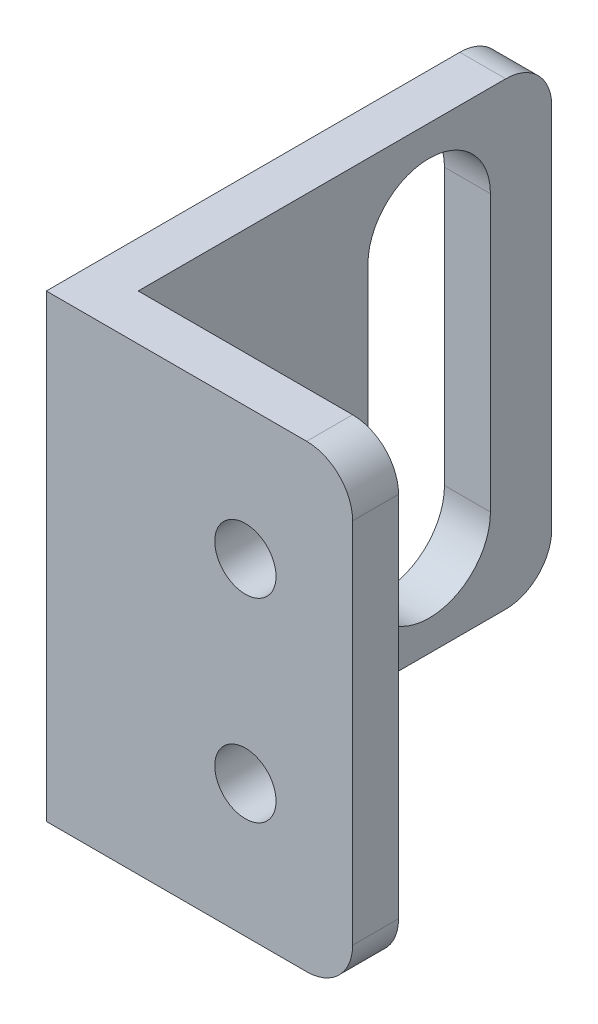
ISO-10303-21;
HEADER;
FILE_DESCRIPTION(('STEP AP214'),'2;1');
FILE_NAME('part.step','',(''),(''),'','','');
FILE_SCHEMA(('AUTOMOTIVE_DESIGN { 1 0 10303 214 1 1 1 1 }'));
ENDSEC;
DATA;
#1=APPLICATION_CONTEXT('core data for automotive mechanical design processes');
#2=APPLICATION_PROTOCOL_DEFINITION('international standard','automotive_design',2000,#1);
#3=PRODUCT_CONTEXT('',#1,'mechanical');
#4=PRODUCT('Part','Part','',(#3));
#5=PRODUCT_RELATED_PRODUCT_CATEGORY('part','',(#4));
#6=PRODUCT_DEFINITION_FORMATION('','',#4);
#7=PRODUCT_DEFINITION_CONTEXT('part definition',#1,'design');
#8=PRODUCT_DEFINITION('design','',#6,#7);
#9=PRODUCT_DEFINITION_SHAPE('','',#8);
#10=(LENGTH_UNIT() NAMED_UNIT(*) SI_UNIT(.MILLI.,.METRE.));
#11=(NAMED_UNIT(*) PLANE_ANGLE_UNIT() SI_UNIT($,.RADIAN.));
#12=(NAMED_UNIT(*) SI_UNIT($,.STERADIAN.) SOLID_ANGLE_UNIT());
#13=UNCERTAINTY_MEASURE_WITH_UNIT(LENGTH_MEASURE(1.E-05),#10,'distance_accuracy_value','');
#14=(GEOMETRIC_REPRESENTATION_CONTEXT(3) GLOBAL_UNCERTAINTY_ASSIGNED_CONTEXT((#13)) GLOBAL_UNIT_ASSIGNED_CONTEXT((#10,
#11,#12)) REPRESENTATION_CONTEXT('',''));
#15=CARTESIAN_POINT('',(0.,0.,0.));
#16=DIRECTION('',(0.,0.,1.));
#17=DIRECTION('',(1.,0.,0.));
#18=AXIS2_PLACEMENT_3D('',#15,#16,#17);
#19=CARTESIAN_POINT('',(-1.5,30.,0.));
#20=DIRECTION('',(1.,0.,0.));
#21=DIRECTION('',(0.,0.,-1.));
#22=AXIS2_PLACEMENT_3D('',#19,#20,#21);
#23=PLANE('',#22);
#24=DIRECTION('',(0.,-1.,0.));
#25=VECTOR('',#24,1.);
#26=CARTESIAN_POINT('',(-1.5,24.,-11.));
#27=LINE('',#26,#25);
#28=CARTESIAN_POINT('',(-1.5,24.,-11.));
#29=VERTEX_POINT('',#28);
#30=CARTESIAN_POINT('',(-1.5,6.,-11.));
#31=VERTEX_POINT('',#30);
#32=EDGE_CURVE('E160',#29,#31,#27,.T.);
#33=ORIENTED_EDGE('',*,*,#32,.F.);
#34=CARTESIAN_POINT('',(-1.5,24.,-7.));
#35=DIRECTION('',(-1.,0.,0.));
#36=DIRECTION('',(0.,0.,1.));
#37=AXIS2_PLACEMENT_3D('',#34,#35,#36);
#38=CIRCLE('',#37,4.);
#39=CARTESIAN_POINT('',(-1.5,24.,-2.99999999999999));
#40=VERTEX_POINT('',#39);
#41=EDGE_CURVE('E165',#40,#29,#38,.T.);
#42=ORIENTED_EDGE('',*,*,#41,.F.);
#43=DIRECTION('',(0.,1.,0.));
#44=VECTOR('',#43,1.);
#45=CARTESIAN_POINT('',(-1.5,24.,-2.99999999999999));
#46=LINE('',#45,#44);
#47=CARTESIAN_POINT('',(-1.5,6.,-2.99999999999999));
#48=VERTEX_POINT('',#47);
#49=EDGE_CURVE('E169',#48,#40,#46,.T.);
#50=ORIENTED_EDGE('',*,*,#49,.F.);
#51=CARTESIAN_POINT('',(-1.5,6.,-7.));
#52=DIRECTION('',(-1.,0.,0.));
#53=DIRECTION('',(0.,0.,1.));
#54=AXIS2_PLACEMENT_3D('',#51,#52,#53);
#55=CIRCLE('',#54,4.);
#56=EDGE_CURVE('E149',#31,#48,#55,.T.);
#57=ORIENTED_EDGE('',*,*,#56,.F.);
#58=EDGE_LOOP('',(#33,#42,#50,#57));
#59=FACE_BOUND('',#58,.T.);
#60=DIRECTION('',(0.,-1.,0.));
#61=VECTOR('',#60,1.);
#62=CARTESIAN_POINT('',(-1.5,30.,-15.));
#63=LINE('',#62,#61);
#64=CARTESIAN_POINT('',(-1.5,27.,-15.));
#65=VERTEX_POINT('',#64);
#66=CARTESIAN_POINT('',(-1.5,3.,-15.));
#67=VERTEX_POINT('',#66);
#68=EDGE_CURVE('E196',#65,#67,#63,.T.);
#69=ORIENTED_EDGE('',*,*,#68,.T.);
#70=CARTESIAN_POINT('',(-1.5,3.,-12.));
#71=DIRECTION('',(1.,0.,0.));
#72=DIRECTION('',(0.,0.,-1.));
#73=AXIS2_PLACEMENT_3D('',#70,#71,#72);
#74=CIRCLE('',#73,3.);
#75=CARTESIAN_POINT('',(-1.5,0.,-12.));
#76=VERTEX_POINT('',#75);
#77=EDGE_CURVE('E249',#67,#76,#74,.F.);
#78=ORIENTED_EDGE('',*,*,#77,.T.);
#79=DIRECTION('',(0.,0.,1.));
#80=VECTOR('',#79,1.);
#81=CARTESIAN_POINT('',(-1.5,0.,0.));
#82=LINE('',#81,#80);
#83=CARTESIAN_POINT('',(-1.5,0.,15.));
#84=VERTEX_POINT('',#83);
#85=EDGE_CURVE('E197',#76,#84,#82,.T.);
#86=ORIENTED_EDGE('',*,*,#85,.T.);
#87=DIRECTION('',(0.,-1.,0.));
#88=VECTOR('',#87,1.);
#89=CARTESIAN_POINT('',(-1.5,30.,15.));
#90=LINE('',#89,#88);
#91=CARTESIAN_POINT('',(-1.5,30.,15.));
#92=VERTEX_POINT('',#91);
#93=EDGE_CURVE('E219',#92,#84,#90,.T.);
#94=ORIENTED_EDGE('',*,*,#93,.F.);
#95=DIRECTION('',(0.,0.,1.));
#96=VECTOR('',#95,1.);
#97=CARTESIAN_POINT('',(-1.5,30.,0.));
#98=LINE('',#97,#96);
#99=CARTESIAN_POINT('',(-1.5,30.,-12.));
#100=VERTEX_POINT('',#99);
#101=EDGE_CURVE('E185',#100,#92,#98,.T.);
#102=ORIENTED_EDGE('',*,*,#101,.F.);
#103=CARTESIAN_POINT('',(-1.5,27.,-12.));
#104=DIRECTION('',(1.,0.,0.));
#105=DIRECTION('',(0.,0.,-1.));
#106=AXIS2_PLACEMENT_3D('',#103,#104,#105);
#107=CIRCLE('',#106,3.);
#108=EDGE_CURVE('E247',#100,#65,#107,.F.);
#109=ORIENTED_EDGE('',*,*,#108,.T.);
#110=EDGE_LOOP('',(#69,#78,#86,#94,#102,#109));
#111=FACE_BOUND('',#110,.T.);
#112=ADVANCED_FACE('F43',(#59,#111),#23,.F.);
#113=CARTESIAN_POINT('',(0.,30.,15.));
#114=DIRECTION('',(0.,0.,-1.));
#115=DIRECTION('',(-1.,0.,0.));
#116=AXIS2_PLACEMENT_3D('',#113,#114,#115);
#117=PLANE('',#116);
#118=CARTESIAN_POINT('',(11.5,21.35,15.));
#119=DIRECTION('',(0.,0.,1.));
#120=DIRECTION('',(1.,0.,0.));
#121=AXIS2_PLACEMENT_3D('',#118,#119,#120);
#122=CIRCLE('',#121,2.);
#123=CARTESIAN_POINT('',(13.5,21.35,15.));
#124=VERTEX_POINT('',#123);
#125=EDGE_CURVE('E179',#124,#124,#122,.T.);
#126=ORIENTED_EDGE('',*,*,#125,.F.);
#127=EDGE_LOOP('',(#126));
#128=FACE_BOUND('',#127,.T.);
#129=CARTESIAN_POINT('',(11.5000000000001,8.65,15.));
#130=DIRECTION('',(0.,0.,1.));
#131=DIRECTION('',(1.,0.,0.));
#132=AXIS2_PLACEMENT_3D('',#129,#130,#131);
#133=CIRCLE('',#132,2.);
#134=CARTESIAN_POINT('',(13.5000000000001,8.65,15.));
#135=VERTEX_POINT('',#134);
#136=EDGE_CURVE('E176',#135,#135,#133,.T.);
#137=ORIENTED_EDGE('',*,*,#136,.F.);
#138=EDGE_LOOP('',(#137));
#139=FACE_BOUND('',#138,.T.);
#140=DIRECTION('',(0.,-1.,0.));
#141=VECTOR('',#140,1.);
#142=CARTESIAN_POINT('',(18.5,30.,15.));
#143=LINE('',#142,#141);
#144=CARTESIAN_POINT('',(18.5,27.,15.));
#145=VERTEX_POINT('',#144);
#146=CARTESIAN_POINT('',(18.5,3.,15.));
#147=VERTEX_POINT('',#146);
#148=EDGE_CURVE('E217',#145,#147,#143,.T.);
#149=ORIENTED_EDGE('',*,*,#148,.F.);
#150=CARTESIAN_POINT('',(15.5,27.,15.));
#151=DIRECTION('',(0.,0.,-1.));
#152=DIRECTION('',(-1.,0.,0.));
#153=AXIS2_PLACEMENT_3D('',#150,#151,#152);
#154=CIRCLE('',#153,3.);
#155=CARTESIAN_POINT('',(15.5,30.,15.));
#156=VERTEX_POINT('',#155);
#157=EDGE_CURVE('E11',#145,#156,#154,.F.);
#158=ORIENTED_EDGE('',*,*,#157,.T.);
#159=DIRECTION('',(1.,0.,0.));
#160=VECTOR('',#159,1.);
#161=CARTESIAN_POINT('',(0.,30.,15.));
#162=LINE('',#161,#160);
#163=EDGE_CURVE('E187',#92,#156,#162,.T.);
#164=ORIENTED_EDGE('',*,*,#163,.F.);
#165=ORIENTED_EDGE('',*,*,#93,.T.);
#166=DIRECTION('',(1.,0.,0.));
#167=VECTOR('',#166,1.);
#168=CARTESIAN_POINT('',(0.,0.,15.));
#169=LINE('',#168,#167);
#170=CARTESIAN_POINT('',(15.5,0.,15.));
#171=VERTEX_POINT('',#170);
#172=EDGE_CURVE('E199',#84,#171,#169,.T.);
#173=ORIENTED_EDGE('',*,*,#172,.T.);
#174=CARTESIAN_POINT('',(15.5,3.,15.));
#175=DIRECTION('',(0.,0.,-1.));
#176=DIRECTION('',(-1.,0.,0.));
#177=AXIS2_PLACEMENT_3D('',#174,#175,#176);
#178=CIRCLE('',#177,3.);
#179=EDGE_CURVE('E51',#171,#147,#178,.F.);
#180=ORIENTED_EDGE('',*,*,#179,.T.);
#181=EDGE_LOOP('',(#149,#158,#164,#165,#173,#180));
#182=FACE_BOUND('',#181,.T.);
#183=ADVANCED_FACE('F281',(#128,#139,#182),#117,.F.);
#184=CARTESIAN_POINT('',(18.5,30.,0.));
#185=DIRECTION('',(-1.,0.,0.));
#186=DIRECTION('',(0.,0.,1.));
#187=AXIS2_PLACEMENT_3D('',#184,#185,#186);
#188=PLANE('',#187);
#189=DIRECTION('',(0.,-1.,0.));
#190=VECTOR('',#189,1.);
#191=CARTESIAN_POINT('',(18.5,30.,12.));
#192=LINE('',#191,#190);
#193=CARTESIAN_POINT('',(18.5,27.,12.));
#194=VERTEX_POINT('',#193);
#195=CARTESIAN_POINT('',(18.5,3.,12.));
#196=VERTEX_POINT('',#195);
#197=EDGE_CURVE('E214',#194,#196,#192,.T.);
#198=ORIENTED_EDGE('',*,*,#197,.F.);
#199=DIRECTION('',(0.,0.,-1.));
#200=VECTOR('',#199,1.);
#201=CARTESIAN_POINT('',(18.5,27.,15.));
#202=LINE('',#201,#200);
#203=EDGE_CURVE('E64',#194,#145,#202,.F.);
#204=ORIENTED_EDGE('',*,*,#203,.T.);
#205=ORIENTED_EDGE('',*,*,#148,.T.);
#206=DIRECTION('',(0.,0.,-1.));
#207=VECTOR('',#206,1.);
#208=CARTESIAN_POINT('',(18.5,3.,0.));
#209=LINE('',#208,#207);
#210=EDGE_CURVE('E260',#147,#196,#209,.T.);
#211=ORIENTED_EDGE('',*,*,#210,.T.);
#212=EDGE_LOOP('',(#198,#204,#205,#211));
#213=FACE_BOUND('',#212,.T.);
#214=ADVANCED_FACE('F264',(#213),#188,.F.);
#215=CARTESIAN_POINT('',(0.,30.,12.));
#216=DIRECTION('',(0.,0.,-1.));
#217=DIRECTION('',(-1.,0.,0.));
#218=AXIS2_PLACEMENT_3D('',#215,#216,#217);
#219=PLANE('',#218);
#220=CARTESIAN_POINT('',(11.5,21.35,12.));
#221=DIRECTION('',(0.,0.,-1.));
#222=DIRECTION('',(-1.,0.,0.));
#223=AXIS2_PLACEMENT_3D('',#220,#221,#222);
#224=CIRCLE('',#223,2.);
#225=CARTESIAN_POINT('',(9.50000000000001,21.35,12.));
#226=VERTEX_POINT('',#225);
#227=EDGE_CURVE('E200',#226,#226,#224,.T.);
#228=ORIENTED_EDGE('',*,*,#227,.F.);
#229=EDGE_LOOP('',(#228));
#230=FACE_BOUND('',#229,.T.);
#231=CARTESIAN_POINT('',(11.5000000000001,8.65,12.));
#232=DIRECTION('',(0.,0.,-1.));
#233=DIRECTION('',(-1.,0.,0.));
#234=AXIS2_PLACEMENT_3D('',#231,#232,#233);
#235=CIRCLE('',#234,2.);
#236=CARTESIAN_POINT('',(9.50000000000014,8.65,12.));
#237=VERTEX_POINT('',#236);
#238=EDGE_CURVE('E182',#237,#237,#235,.T.);
#239=ORIENTED_EDGE('',*,*,#238,.F.);
#240=EDGE_LOOP('',(#239));
#241=FACE_BOUND('',#240,.T.);
#242=DIRECTION('',(1.,0.,0.));
#243=VECTOR('',#242,1.);
#244=CARTESIAN_POINT('',(0.,30.,12.));
#245=LINE('',#244,#243);
#246=CARTESIAN_POINT('',(1.5,30.,12.));
#247=VERTEX_POINT('',#246);
#248=CARTESIAN_POINT('',(15.5,30.,12.));
#249=VERTEX_POINT('',#248);
#250=EDGE_CURVE('E191',#247,#249,#245,.T.);
#251=ORIENTED_EDGE('',*,*,#250,.T.);
#252=CARTESIAN_POINT('',(15.5,27.,12.));
#253=DIRECTION('',(0.,0.,-1.));
#254=DIRECTION('',(-1.,0.,0.));
#255=AXIS2_PLACEMENT_3D('',#252,#253,#254);
#256=CIRCLE('',#255,3.);
#257=EDGE_CURVE('E258',#249,#194,#256,.T.);
#258=ORIENTED_EDGE('',*,*,#257,.T.);
#259=ORIENTED_EDGE('',*,*,#197,.T.);
#260=CARTESIAN_POINT('',(15.5,3.,12.));
#261=DIRECTION('',(0.,0.,-1.));
#262=DIRECTION('',(-1.,0.,0.));
#263=AXIS2_PLACEMENT_3D('',#260,#261,#262);
#264=CIRCLE('',#263,3.);
#265=CARTESIAN_POINT('',(15.5,0.,12.));
#266=VERTEX_POINT('',#265);
#267=EDGE_CURVE('E256',#196,#266,#264,.T.);
#268=ORIENTED_EDGE('',*,*,#267,.T.);
#269=DIRECTION('',(1.,0.,0.));
#270=VECTOR('',#269,1.);
#271=CARTESIAN_POINT('',(0.,0.,12.));
#272=LINE('',#271,#270);
#273=CARTESIAN_POINT('',(1.5,0.,12.));
#274=VERTEX_POINT('',#273);
#275=EDGE_CURVE('E202',#274,#266,#272,.T.);
#276=ORIENTED_EDGE('',*,*,#275,.F.);
#277=DIRECTION('',(0.,-1.,0.));
#278=VECTOR('',#277,1.);
#279=CARTESIAN_POINT('',(1.5,30.,12.));
#280=LINE('',#279,#278);
#281=EDGE_CURVE('E211',#247,#274,#280,.T.);
#282=ORIENTED_EDGE('',*,*,#281,.F.);
#283=EDGE_LOOP('',(#251,#258,#259,#268,#276,#282));
#284=FACE_BOUND('',#283,.T.);
#285=ADVANCED_FACE('F267',(#230,#241,#284),#219,.T.);
#286=CARTESIAN_POINT('',(1.5,30.,0.));
#287=DIRECTION('',(1.,0.,0.));
#288=DIRECTION('',(0.,0.,-1.));
#289=AXIS2_PLACEMENT_3D('',#286,#287,#288);
#290=PLANE('',#289);
#291=CARTESIAN_POINT('',(1.5,24.,-7.));
#292=DIRECTION('',(1.,0.,0.));
#293=DIRECTION('',(0.,0.,-1.));
#294=AXIS2_PLACEMENT_3D('',#291,#292,#293);
#295=CIRCLE('',#294,4.);
#296=CARTESIAN_POINT('',(1.5,24.,-11.));
#297=VERTEX_POINT('',#296);
#298=CARTESIAN_POINT('',(1.5,24.,-2.99999999999999));
#299=VERTEX_POINT('',#298);
#300=EDGE_CURVE('E231',#297,#299,#295,.T.);
#301=ORIENTED_EDGE('',*,*,#300,.F.);
#302=DIRECTION('',(0.,1.,0.));
#303=VECTOR('',#302,1.);
#304=CARTESIAN_POINT('',(1.5,30.,-11.));
#305=LINE('',#304,#303);
#306=CARTESIAN_POINT('',(1.5,6.,-11.));
#307=VERTEX_POINT('',#306);
#308=EDGE_CURVE('E222',#307,#297,#305,.T.);
#309=ORIENTED_EDGE('',*,*,#308,.F.);
#310=CARTESIAN_POINT('',(1.5,6.,-7.));
#311=DIRECTION('',(1.,0.,0.));
#312=DIRECTION('',(0.,0.,-1.));
#313=AXIS2_PLACEMENT_3D('',#310,#311,#312);
#314=CIRCLE('',#313,4.);
#315=CARTESIAN_POINT('',(1.5,6.,-2.99999999999999));
#316=VERTEX_POINT('',#315);
#317=EDGE_CURVE('E152',#316,#307,#314,.T.);
#318=ORIENTED_EDGE('',*,*,#317,.F.);
#319=DIRECTION('',(0.,-1.,0.));
#320=VECTOR('',#319,1.);
#321=CARTESIAN_POINT('',(1.5,30.,-2.99999999999999));
#322=LINE('',#321,#320);
#323=EDGE_CURVE('E229',#299,#316,#322,.T.);
#324=ORIENTED_EDGE('',*,*,#323,.F.);
#325=EDGE_LOOP('',(#301,#309,#318,#324));
#326=FACE_BOUND('',#325,.T.);
#327=DIRECTION('',(0.,0.,1.));
#328=VECTOR('',#327,1.);
#329=CARTESIAN_POINT('',(1.5,0.,0.));
#330=LINE('',#329,#328);
#331=CARTESIAN_POINT('',(1.5,0.,-12.));
#332=VERTEX_POINT('',#331);
#333=EDGE_CURVE('E188',#332,#274,#330,.T.);
#334=ORIENTED_EDGE('',*,*,#333,.F.);
#335=CARTESIAN_POINT('',(1.5,3.,-12.));
#336=DIRECTION('',(1.,0.,0.));
#337=DIRECTION('',(0.,0.,-1.));
#338=AXIS2_PLACEMENT_3D('',#335,#336,#337);
#339=CIRCLE('',#338,3.);
#340=CARTESIAN_POINT('',(1.5,3.,-15.));
#341=VERTEX_POINT('',#340);
#342=EDGE_CURVE('E240',#332,#341,#339,.T.);
#343=ORIENTED_EDGE('',*,*,#342,.T.);
#344=DIRECTION('',(0.,-1.,0.));
#345=VECTOR('',#344,1.);
#346=CARTESIAN_POINT('',(1.5,30.,-15.));
#347=LINE('',#346,#345);
#348=CARTESIAN_POINT('',(1.5,27.,-15.));
#349=VERTEX_POINT('',#348);
#350=EDGE_CURVE('E208',#349,#341,#347,.T.);
#351=ORIENTED_EDGE('',*,*,#350,.F.);
#352=CARTESIAN_POINT('',(1.5,27.,-12.));
#353=DIRECTION('',(1.,0.,0.));
#354=DIRECTION('',(0.,0.,-1.));
#355=AXIS2_PLACEMENT_3D('',#352,#353,#354);
#356=CIRCLE('',#355,3.);
#357=CARTESIAN_POINT('',(1.5,30.,-12.));
#358=VERTEX_POINT('',#357);
#359=EDGE_CURVE('E238',#349,#358,#356,.T.);
#360=ORIENTED_EDGE('',*,*,#359,.T.);
#361=DIRECTION('',(0.,0.,1.));
#362=VECTOR('',#361,1.);
#363=CARTESIAN_POINT('',(1.5,30.,0.));
#364=LINE('',#363,#362);
#365=EDGE_CURVE('E194',#358,#247,#364,.T.);
#366=ORIENTED_EDGE('',*,*,#365,.T.);
#367=ORIENTED_EDGE('',*,*,#281,.T.);
#368=EDGE_LOOP('',(#334,#343,#351,#360,#366,#367));
#369=FACE_BOUND('',#368,.T.);
#370=ADVANCED_FACE('F322',(#326,#369),#290,.T.);
#371=CARTESIAN_POINT('',(0.,30.,-15.));
#372=DIRECTION('',(0.,0.,-1.));
#373=DIRECTION('',(-1.,0.,0.));
#374=AXIS2_PLACEMENT_3D('',#371,#372,#373);
#375=PLANE('',#374);
#376=ORIENTED_EDGE('',*,*,#350,.T.);
#377=DIRECTION('',(1.,0.,0.));
#378=VECTOR('',#377,1.);
#379=CARTESIAN_POINT('',(-1.5,3.,-15.));
#380=LINE('',#379,#378);
#381=EDGE_CURVE('E245',#341,#67,#380,.F.);
#382=ORIENTED_EDGE('',*,*,#381,.T.);
#383=ORIENTED_EDGE('',*,*,#68,.F.);
#384=DIRECTION('',(1.,0.,0.));
#385=VECTOR('',#384,1.);
#386=CARTESIAN_POINT('',(0.,27.,-15.));
#387=LINE('',#386,#385);
#388=EDGE_CURVE('E242',#65,#349,#387,.T.);
#389=ORIENTED_EDGE('',*,*,#388,.T.);
#390=EDGE_LOOP('',(#376,#382,#383,#389));
#391=FACE_BOUND('',#390,.T.);
#392=ADVANCED_FACE('F317',(#391),#375,.T.);
#393=CARTESIAN_POINT('',(0.,30.,0.));
#394=DIRECTION('',(0.,1.,0.));
#395=DIRECTION('',(0.,0.,1.));
#396=AXIS2_PLACEMENT_3D('',#393,#394,#395);
#397=PLANE('',#396);
#398=ORIENTED_EDGE('',*,*,#365,.F.);
#399=DIRECTION('',(1.,0.,0.));
#400=VECTOR('',#399,1.);
#401=CARTESIAN_POINT('',(0.,30.,-12.));
#402=LINE('',#401,#400);
#403=EDGE_CURVE('E254',#358,#100,#402,.F.);
#404=ORIENTED_EDGE('',*,*,#403,.T.);
#405=ORIENTED_EDGE('',*,*,#101,.T.);
#406=ORIENTED_EDGE('',*,*,#163,.T.);
#407=DIRECTION('',(0.,0.,-1.));
#408=VECTOR('',#407,1.);
#409=CARTESIAN_POINT('',(15.5,30.,12.));
#410=LINE('',#409,#408);
#411=EDGE_CURVE('E251',#156,#249,#410,.T.);
#412=ORIENTED_EDGE('',*,*,#411,.T.);
#413=ORIENTED_EDGE('',*,*,#250,.F.);
#414=EDGE_LOOP('',(#398,#404,#405,#406,#412,#413));
#415=FACE_BOUND('',#414,.T.);
#416=ADVANCED_FACE('F277',(#415),#397,.T.);
#417=CARTESIAN_POINT('',(0.,0.,0.));
#418=DIRECTION('',(0.,1.,0.));
#419=DIRECTION('',(0.,0.,1.));
#420=AXIS2_PLACEMENT_3D('',#417,#418,#419);
#421=PLANE('',#420);
#422=ORIENTED_EDGE('',*,*,#85,.F.);
#423=DIRECTION('',(1.,0.,0.));
#424=VECTOR('',#423,1.);
#425=CARTESIAN_POINT('',(1.5,0.,-12.));
#426=LINE('',#425,#424);
#427=EDGE_CURVE('E235',#76,#332,#426,.T.);
#428=ORIENTED_EDGE('',*,*,#427,.T.);
#429=ORIENTED_EDGE('',*,*,#333,.T.);
#430=ORIENTED_EDGE('',*,*,#275,.T.);
#431=DIRECTION('',(0.,0.,-1.));
#432=VECTOR('',#431,1.);
#433=CARTESIAN_POINT('',(15.5,0.,0.));
#434=LINE('',#433,#432);
#435=EDGE_CURVE('E233',#266,#171,#434,.F.);
#436=ORIENTED_EDGE('',*,*,#435,.T.);
#437=ORIENTED_EDGE('',*,*,#172,.F.);
#438=EDGE_LOOP('',(#422,#428,#429,#430,#436,#437));
#439=FACE_BOUND('',#438,.T.);
#440=ADVANCED_FACE('F288',(#439),#421,.F.);
#441=CARTESIAN_POINT('',(11.5000000000001,8.65,5.));
#442=DIRECTION('',(0.,0.,1.));
#443=DIRECTION('',(1.,0.,0.));
#444=AXIS2_PLACEMENT_3D('',#441,#442,#443);
#445=CYLINDRICAL_SURFACE('',#444,2.);
#446=ORIENTED_EDGE('',*,*,#238,.T.);
#447=EDGE_LOOP('',(#446));
#448=FACE_BOUND('',#447,.T.);
#449=ORIENTED_EDGE('',*,*,#136,.T.);
#450=EDGE_LOOP('',(#449));
#451=FACE_BOUND('',#450,.T.);
#452=ADVANCED_FACE('F379',(#448,#451),#445,.F.);
#453=CARTESIAN_POINT('',(11.5,21.35,5.));
#454=DIRECTION('',(0.,0.,1.));
#455=DIRECTION('',(1.,0.,0.));
#456=AXIS2_PLACEMENT_3D('',#453,#454,#455);
#457=CYLINDRICAL_SURFACE('',#456,2.);
#458=ORIENTED_EDGE('',*,*,#227,.T.);
#459=EDGE_LOOP('',(#458));
#460=FACE_BOUND('',#459,.T.);
#461=ORIENTED_EDGE('',*,*,#125,.T.);
#462=EDGE_LOOP('',(#461));
#463=FACE_BOUND('',#462,.T.);
#464=ADVANCED_FACE('F393',(#460,#463),#457,.F.);
#465=CARTESIAN_POINT('',(8.5,24.,-7.));
#466=DIRECTION('',(-1.,0.,0.));
#467=DIRECTION('',(0.,0.,1.));
#468=AXIS2_PLACEMENT_3D('',#465,#466,#467);
#469=CYLINDRICAL_SURFACE('',#468,4.);
#470=ORIENTED_EDGE('',*,*,#300,.T.);
#471=DIRECTION('',(-1.,0.,0.));
#472=VECTOR('',#471,1.);
#473=CARTESIAN_POINT('',(8.5,24.,-3.));
#474=LINE('',#473,#472);
#475=EDGE_CURVE('E174',#299,#40,#474,.T.);
#476=ORIENTED_EDGE('',*,*,#475,.T.);
#477=ORIENTED_EDGE('',*,*,#41,.T.);
#478=DIRECTION('',(-1.,0.,0.));
#479=VECTOR('',#478,1.);
#480=CARTESIAN_POINT('',(8.5,24.,-11.));
#481=LINE('',#480,#479);
#482=EDGE_CURVE('E156',#297,#29,#481,.T.);
#483=ORIENTED_EDGE('',*,*,#482,.F.);
#484=EDGE_LOOP('',(#470,#476,#477,#483));
#485=FACE_BOUND('',#484,.T.);
#486=ADVANCED_FACE('F403',(#485),#469,.F.);
#487=CARTESIAN_POINT('',(8.5,24.,-3.));
#488=DIRECTION('',(0.,0.,1.));
#489=DIRECTION('',(1.,0.,0.));
#490=AXIS2_PLACEMENT_3D('',#487,#488,#489);
#491=PLANE('',#490);
#492=ORIENTED_EDGE('',*,*,#323,.T.);
#493=DIRECTION('',(-1.,0.,0.));
#494=VECTOR('',#493,1.);
#495=CARTESIAN_POINT('',(8.5,6.,-3.));
#496=LINE('',#495,#494);
#497=EDGE_CURVE('E155',#316,#48,#496,.T.);
#498=ORIENTED_EDGE('',*,*,#497,.T.);
#499=ORIENTED_EDGE('',*,*,#49,.T.);
#500=ORIENTED_EDGE('',*,*,#475,.F.);
#501=EDGE_LOOP('',(#492,#498,#499,#500));
#502=FACE_BOUND('',#501,.T.);
#503=ADVANCED_FACE('F413',(#502),#491,.F.);
#504=CARTESIAN_POINT('',(8.5,6.,-7.));
#505=DIRECTION('',(-1.,0.,0.));
#506=DIRECTION('',(0.,0.,1.));
#507=AXIS2_PLACEMENT_3D('',#504,#505,#506);
#508=CYLINDRICAL_SURFACE('',#507,4.);
#509=ORIENTED_EDGE('',*,*,#317,.T.);
#510=DIRECTION('',(-1.,0.,0.));
#511=VECTOR('',#510,1.);
#512=CARTESIAN_POINT('',(8.5,6.,-11.));
#513=LINE('',#512,#511);
#514=EDGE_CURVE('E144',#307,#31,#513,.T.);
#515=ORIENTED_EDGE('',*,*,#514,.T.);
#516=ORIENTED_EDGE('',*,*,#56,.T.);
#517=ORIENTED_EDGE('',*,*,#497,.F.);
#518=EDGE_LOOP('',(#509,#515,#516,#517));
#519=FACE_BOUND('',#518,.T.);
#520=ADVANCED_FACE('F146',(#519),#508,.F.);
#521=CARTESIAN_POINT('',(8.5,24.,-11.));
#522=DIRECTION('',(0.,0.,-1.));
#523=DIRECTION('',(-1.,0.,0.));
#524=AXIS2_PLACEMENT_3D('',#521,#522,#523);
#525=PLANE('',#524);
#526=ORIENTED_EDGE('',*,*,#308,.T.);
#527=ORIENTED_EDGE('',*,*,#482,.T.);
#528=ORIENTED_EDGE('',*,*,#32,.T.);
#529=ORIENTED_EDGE('',*,*,#514,.F.);
#530=EDGE_LOOP('',(#526,#527,#528,#529));
#531=FACE_BOUND('',#530,.T.);
#532=ADVANCED_FACE('F161',(#531),#525,.F.);
#533=CARTESIAN_POINT('',(0.,3.,-12.));
#534=DIRECTION('',(-1.,0.,0.));
#535=DIRECTION('',(0.,0.,1.));
#536=AXIS2_PLACEMENT_3D('',#533,#534,#535);
#537=CYLINDRICAL_SURFACE('',#536,3.);
#538=ORIENTED_EDGE('',*,*,#77,.F.);
#539=ORIENTED_EDGE('',*,*,#381,.F.);
#540=ORIENTED_EDGE('',*,*,#342,.F.);
#541=ORIENTED_EDGE('',*,*,#427,.F.);
#542=EDGE_LOOP('',(#538,#539,#540,#541));
#543=FACE_BOUND('',#542,.T.);
#544=ADVANCED_FACE('F305',(#543),#537,.T.);
#545=CARTESIAN_POINT('',(0.,27.,-12.));
#546=DIRECTION('',(1.,0.,0.));
#547=DIRECTION('',(0.,0.,-1.));
#548=AXIS2_PLACEMENT_3D('',#545,#546,#547);
#549=CYLINDRICAL_SURFACE('',#548,3.);
#550=ORIENTED_EDGE('',*,*,#108,.F.);
#551=ORIENTED_EDGE('',*,*,#403,.F.);
#552=ORIENTED_EDGE('',*,*,#359,.F.);
#553=ORIENTED_EDGE('',*,*,#388,.F.);
#554=EDGE_LOOP('',(#550,#551,#552,#553));
#555=FACE_BOUND('',#554,.T.);
#556=ADVANCED_FACE('F294',(#555),#549,.T.);
#557=CARTESIAN_POINT('',(15.5,27.,0.));
#558=DIRECTION('',(0.,0.,1.));
#559=DIRECTION('',(1.,0.,0.));
#560=AXIS2_PLACEMENT_3D('',#557,#558,#559);
#561=CYLINDRICAL_SURFACE('',#560,3.);
#562=ORIENTED_EDGE('',*,*,#157,.F.);
#563=ORIENTED_EDGE('',*,*,#203,.F.);
#564=ORIENTED_EDGE('',*,*,#257,.F.);
#565=ORIENTED_EDGE('',*,*,#411,.F.);
#566=EDGE_LOOP('',(#562,#563,#564,#565));
#567=FACE_BOUND('',#566,.T.);
#568=ADVANCED_FACE('F274',(#567),#561,.T.);
#569=CARTESIAN_POINT('',(15.5,3.,0.));
#570=DIRECTION('',(0.,0.,-1.));
#571=DIRECTION('',(-1.,0.,0.));
#572=AXIS2_PLACEMENT_3D('',#569,#570,#571);
#573=CYLINDRICAL_SURFACE('',#572,3.);
#574=ORIENTED_EDGE('',*,*,#179,.F.);
#575=ORIENTED_EDGE('',*,*,#435,.F.);
#576=ORIENTED_EDGE('',*,*,#267,.F.);
#577=ORIENTED_EDGE('',*,*,#210,.F.);
#578=EDGE_LOOP('',(#574,#575,#576,#577));
#579=FACE_BOUND('',#578,.T.);
#580=ADVANCED_FACE('F45',(#579),#573,.T.);
#581=CLOSED_SHELL('',(#112,#183,#214,#285,#370,#392,#416,#440,#452,#464,#486,#503,#520,#532,
#544,#556,#568,#580));
#582=MANIFOLD_SOLID_BREP('B2',#581);
#583=ADVANCED_BREP_SHAPE_REPRESENTATION('',(#18,#582),#14);
#584=SHAPE_DEFINITION_REPRESENTATION(#9,#583);
ENDSEC;
END-ISO-10303-21;
